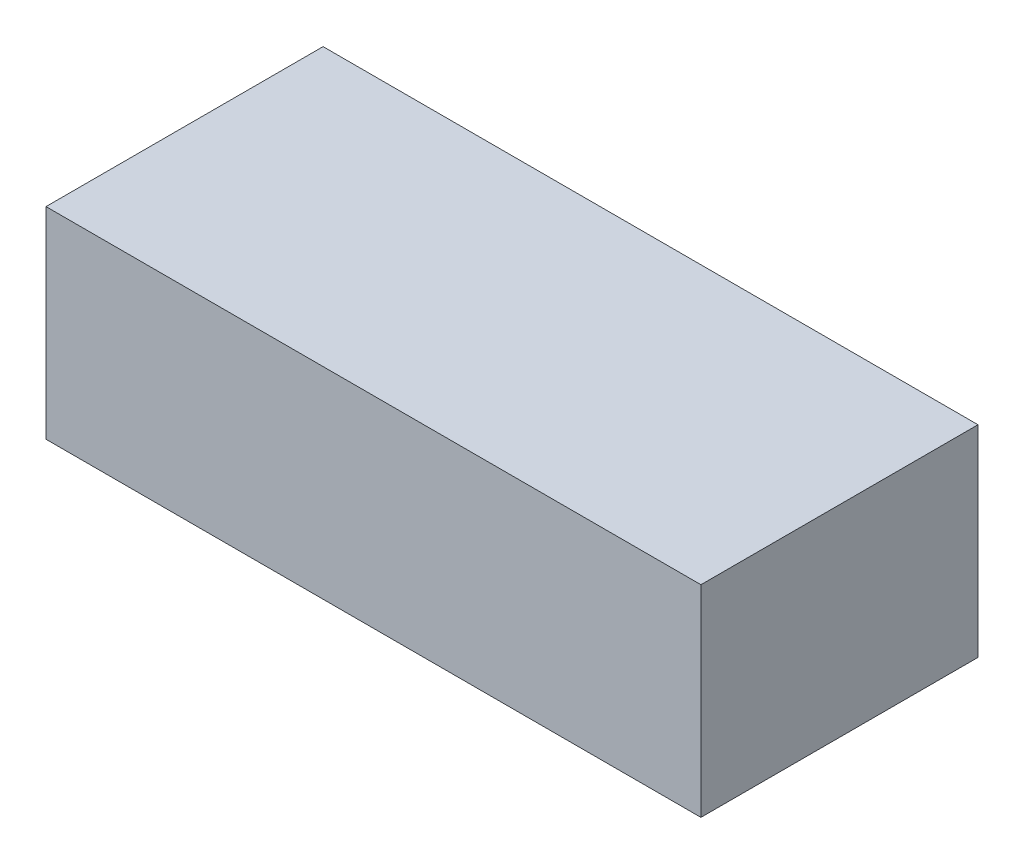
ISO-10303-21;
HEADER;
FILE_DESCRIPTION(('STEP AP214'),'2;1');
FILE_NAME('part.step','',(''),(''),'','','');
FILE_SCHEMA(('AUTOMOTIVE_DESIGN { 1 0 10303 214 1 1 1 1 }'));
ENDSEC;
DATA;
#1=APPLICATION_CONTEXT('core data for automotive mechanical design processes');
#2=APPLICATION_PROTOCOL_DEFINITION('international standard','automotive_design',2000,#1);
#3=PRODUCT_CONTEXT('',#1,'mechanical');
#4=PRODUCT('Part','Part','',(#3));
#5=PRODUCT_RELATED_PRODUCT_CATEGORY('part','',(#4));
#6=PRODUCT_DEFINITION_FORMATION('','',#4);
#7=PRODUCT_DEFINITION_CONTEXT('part definition',#1,'design');
#8=PRODUCT_DEFINITION('design','',#6,#7);
#9=PRODUCT_DEFINITION_SHAPE('','',#8);
#10=(LENGTH_UNIT() NAMED_UNIT(*) SI_UNIT(.MILLI.,.METRE.));
#11=(NAMED_UNIT(*) PLANE_ANGLE_UNIT() SI_UNIT($,.RADIAN.));
#12=(NAMED_UNIT(*) SI_UNIT($,.STERADIAN.) SOLID_ANGLE_UNIT());
#13=UNCERTAINTY_MEASURE_WITH_UNIT(LENGTH_MEASURE(1.E-05),#10,'distance_accuracy_value','');
#14=(GEOMETRIC_REPRESENTATION_CONTEXT(3) GLOBAL_UNCERTAINTY_ASSIGNED_CONTEXT((#13)) GLOBAL_UNIT_ASSIGNED_CONTEXT((#10,
#11,#12)) REPRESENTATION_CONTEXT('',''));
#15=CARTESIAN_POINT('',(0.,0.,0.));
#16=DIRECTION('',(0.,0.,1.));
#17=DIRECTION('',(1.,0.,0.));
#18=AXIS2_PLACEMENT_3D('',#15,#16,#17);
#19=CARTESIAN_POINT('',(0.,24.,0.));
#20=DIRECTION('',(1.,0.,0.));
#21=DIRECTION('',(0.,0.,-1.));
#22=AXIS2_PLACEMENT_3D('',#19,#20,#21);
#23=PLANE('',#22);
#24=DIRECTION('',(0.,0.,1.));
#25=VECTOR('',#24,1.);
#26=CARTESIAN_POINT('',(0.,0.,0.));
#27=LINE('',#26,#25);
#28=CARTESIAN_POINT('',(0.,0.,-33.));
#29=VERTEX_POINT('',#28);
#30=CARTESIAN_POINT('',(0.,0.,0.));
#31=VERTEX_POINT('',#30);
#32=EDGE_CURVE('E107',#29,#31,#27,.T.);
#33=ORIENTED_EDGE('',*,*,#32,.T.);
#34=DIRECTION('',(0.,-1.,0.));
#35=VECTOR('',#34,1.);
#36=CARTESIAN_POINT('',(0.,24.,0.));
#37=LINE('',#36,#35);
#38=CARTESIAN_POINT('',(0.,24.,0.));
#39=VERTEX_POINT('',#38);
#40=EDGE_CURVE('E11',#39,#31,#37,.T.);
#41=ORIENTED_EDGE('',*,*,#40,.F.);
#42=DIRECTION('',(0.,0.,1.));
#43=VECTOR('',#42,1.);
#44=CARTESIAN_POINT('',(0.,24.,0.));
#45=LINE('',#44,#43);
#46=CARTESIAN_POINT('',(0.,24.,-33.));
#47=VERTEX_POINT('',#46);
#48=EDGE_CURVE('E91',#47,#39,#45,.T.);
#49=ORIENTED_EDGE('',*,*,#48,.F.);
#50=DIRECTION('',(0.,-1.,0.));
#51=VECTOR('',#50,1.);
#52=CARTESIAN_POINT('',(0.,24.,-33.));
#53=LINE('',#52,#51);
#54=EDGE_CURVE('E103',#47,#29,#53,.T.);
#55=ORIENTED_EDGE('',*,*,#54,.T.);
#56=EDGE_LOOP('',(#33,#41,#49,#55));
#57=FACE_BOUND('',#56,.T.);
#58=ADVANCED_FACE('F39',(#57),#23,.F.);
#59=CARTESIAN_POINT('',(0.,24.,0.));
#60=DIRECTION('',(0.,0.,-1.));
#61=DIRECTION('',(-1.,0.,0.));
#62=AXIS2_PLACEMENT_3D('',#59,#60,#61);
#63=PLANE('',#62);
#64=DIRECTION('',(1.,0.,0.));
#65=VECTOR('',#64,1.);
#66=CARTESIAN_POINT('',(0.,0.,0.));
#67=LINE('',#66,#65);
#68=CARTESIAN_POINT('',(78.,0.,0.));
#69=VERTEX_POINT('',#68);
#70=EDGE_CURVE('E96',#31,#69,#67,.T.);
#71=ORIENTED_EDGE('',*,*,#70,.T.);
#72=DIRECTION('',(0.,-1.,0.));
#73=VECTOR('',#72,1.);
#74=CARTESIAN_POINT('',(78.,24.,0.));
#75=LINE('',#74,#73);
#76=CARTESIAN_POINT('',(78.,24.,0.));
#77=VERTEX_POINT('',#76);
#78=EDGE_CURVE('E48',#77,#69,#75,.T.);
#79=ORIENTED_EDGE('',*,*,#78,.F.);
#80=DIRECTION('',(1.,0.,0.));
#81=VECTOR('',#80,1.);
#82=CARTESIAN_POINT('',(0.,24.,0.));
#83=LINE('',#82,#81);
#84=EDGE_CURVE('E86',#39,#77,#83,.T.);
#85=ORIENTED_EDGE('',*,*,#84,.F.);
#86=ORIENTED_EDGE('',*,*,#40,.T.);
#87=EDGE_LOOP('',(#71,#79,#85,#86));
#88=FACE_BOUND('',#87,.T.);
#89=ADVANCED_FACE('F95',(#88),#63,.F.);
#90=CARTESIAN_POINT('',(78.,24.,0.));
#91=DIRECTION('',(-1.,0.,0.));
#92=DIRECTION('',(0.,0.,1.));
#93=AXIS2_PLACEMENT_3D('',#90,#91,#92);
#94=PLANE('',#93);
#95=DIRECTION('',(0.,0.,-1.));
#96=VECTOR('',#95,1.);
#97=CARTESIAN_POINT('',(78.,0.,0.));
#98=LINE('',#97,#96);
#99=CARTESIAN_POINT('',(78.,0.,-33.));
#100=VERTEX_POINT('',#99);
#101=EDGE_CURVE('E73',#69,#100,#98,.T.);
#102=ORIENTED_EDGE('',*,*,#101,.T.);
#103=DIRECTION('',(0.,-1.,0.));
#104=VECTOR('',#103,1.);
#105=CARTESIAN_POINT('',(78.,24.,-33.));
#106=LINE('',#105,#104);
#107=CARTESIAN_POINT('',(78.,24.,-33.));
#108=VERTEX_POINT('',#107);
#109=EDGE_CURVE('E98',#108,#100,#106,.T.);
#110=ORIENTED_EDGE('',*,*,#109,.F.);
#111=DIRECTION('',(0.,0.,-1.));
#112=VECTOR('',#111,1.);
#113=CARTESIAN_POINT('',(78.,24.,0.));
#114=LINE('',#113,#112);
#115=EDGE_CURVE('E89',#77,#108,#114,.T.);
#116=ORIENTED_EDGE('',*,*,#115,.F.);
#117=ORIENTED_EDGE('',*,*,#78,.T.);
#118=EDGE_LOOP('',(#102,#110,#116,#117));
#119=FACE_BOUND('',#118,.T.);
#120=ADVANCED_FACE('F99',(#119),#94,.F.);
#121=CARTESIAN_POINT('',(0.,24.,-33.));
#122=DIRECTION('',(0.,0.,1.));
#123=DIRECTION('',(1.,0.,0.));
#124=AXIS2_PLACEMENT_3D('',#121,#122,#123);
#125=PLANE('',#124);
#126=DIRECTION('',(-1.,0.,0.));
#127=VECTOR('',#126,1.);
#128=CARTESIAN_POINT('',(0.,0.,-33.));
#129=LINE('',#128,#127);
#130=EDGE_CURVE('E79',#100,#29,#129,.T.);
#131=ORIENTED_EDGE('',*,*,#130,.T.);
#132=ORIENTED_EDGE('',*,*,#54,.F.);
#133=DIRECTION('',(-1.,0.,0.));
#134=VECTOR('',#133,1.);
#135=CARTESIAN_POINT('',(0.,24.,-33.));
#136=LINE('',#135,#134);
#137=EDGE_CURVE('E56',#108,#47,#136,.T.);
#138=ORIENTED_EDGE('',*,*,#137,.F.);
#139=ORIENTED_EDGE('',*,*,#109,.T.);
#140=EDGE_LOOP('',(#131,#132,#138,#139));
#141=FACE_BOUND('',#140,.T.);
#142=ADVANCED_FACE('F120',(#141),#125,.F.);
#143=CARTESIAN_POINT('',(0.,24.,0.));
#144=DIRECTION('',(0.,-1.,0.));
#145=DIRECTION('',(0.,0.,-1.));
#146=AXIS2_PLACEMENT_3D('',#143,#144,#145);
#147=PLANE('',#146);
#148=ORIENTED_EDGE('',*,*,#48,.T.);
#149=ORIENTED_EDGE('',*,*,#84,.T.);
#150=ORIENTED_EDGE('',*,*,#115,.T.);
#151=ORIENTED_EDGE('',*,*,#137,.T.);
#152=EDGE_LOOP('',(#148,#149,#150,#151));
#153=FACE_BOUND('',#152,.T.);
#154=ADVANCED_FACE('F87',(#153),#147,.F.);
#155=CARTESIAN_POINT('',(0.,0.,0.));
#156=DIRECTION('',(0.,-1.,0.));
#157=DIRECTION('',(0.,0.,-1.));
#158=AXIS2_PLACEMENT_3D('',#155,#156,#157);
#159=PLANE('',#158);
#160=ORIENTED_EDGE('',*,*,#32,.F.);
#161=ORIENTED_EDGE('',*,*,#130,.F.);
#162=ORIENTED_EDGE('',*,*,#101,.F.);
#163=ORIENTED_EDGE('',*,*,#70,.F.);
#164=EDGE_LOOP('',(#160,#161,#162,#163));
#165=FACE_BOUND('',#164,.T.);
#166=ADVANCED_FACE('F123',(#165),#159,.T.);
#167=CLOSED_SHELL('',(#58,#89,#120,#142,#154,#166));
#168=MANIFOLD_SOLID_BREP('B2',#167);
#169=ADVANCED_BREP_SHAPE_REPRESENTATION('',(#18,#168),#14);
#170=SHAPE_DEFINITION_REPRESENTATION(#9,#169);
ENDSEC;
END-ISO-10303-21;
